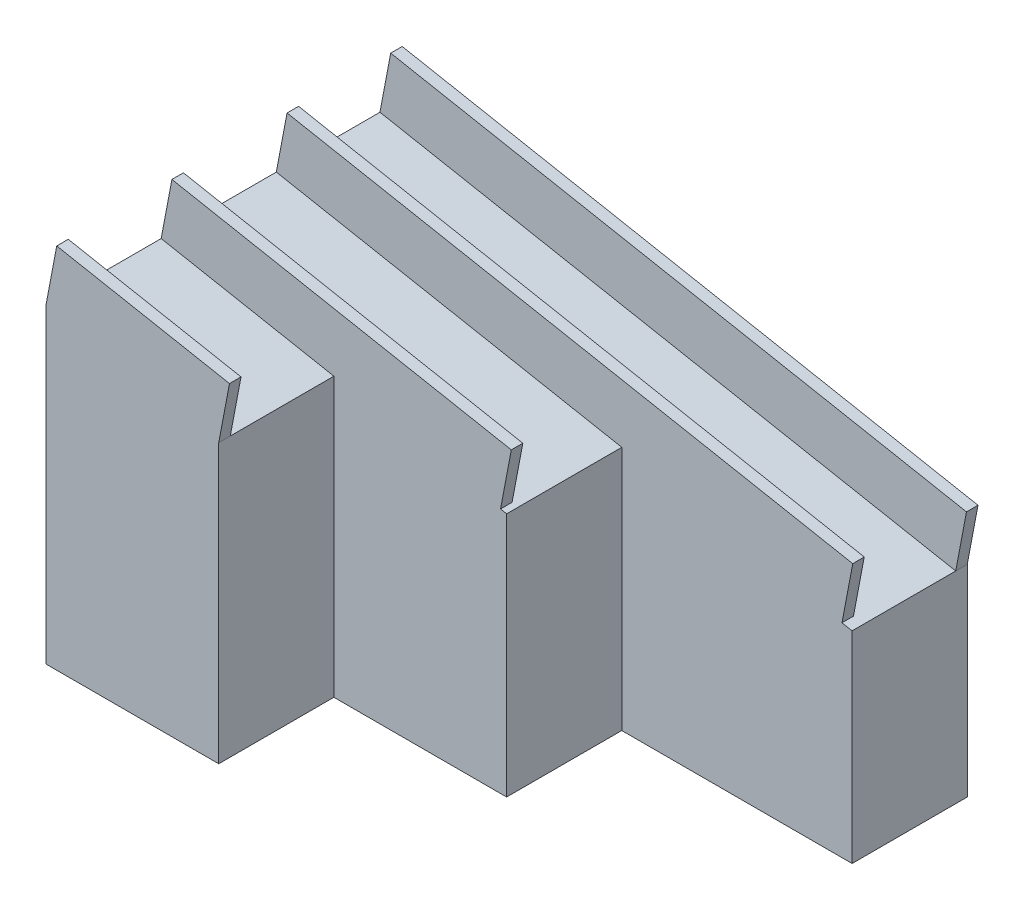
ISO-10303-21;
HEADER;
FILE_DESCRIPTION(('STEP AP214'),'2;1');
FILE_NAME('part.step','',(''),(''),'','','');
FILE_SCHEMA(('AUTOMOTIVE_DESIGN { 1 0 10303 214 1 1 1 1 }'));
ENDSEC;
DATA;
#1=APPLICATION_CONTEXT('core data for automotive mechanical design processes');
#2=APPLICATION_PROTOCOL_DEFINITION('international standard','automotive_design',2000,#1);
#3=PRODUCT_CONTEXT('',#1,'mechanical');
#4=PRODUCT('Part','Part','',(#3));
#5=PRODUCT_RELATED_PRODUCT_CATEGORY('part','',(#4));
#6=PRODUCT_DEFINITION_FORMATION('','',#4);
#7=PRODUCT_DEFINITION_CONTEXT('part definition',#1,'design');
#8=PRODUCT_DEFINITION('design','',#6,#7);
#9=PRODUCT_DEFINITION_SHAPE('','',#8);
#10=(LENGTH_UNIT() NAMED_UNIT(*) SI_UNIT(.MILLI.,.METRE.));
#11=(NAMED_UNIT(*) PLANE_ANGLE_UNIT() SI_UNIT($,.RADIAN.));
#12=(NAMED_UNIT(*) SI_UNIT($,.STERADIAN.) SOLID_ANGLE_UNIT());
#13=UNCERTAINTY_MEASURE_WITH_UNIT(LENGTH_MEASURE(1.E-05),#10,'distance_accuracy_value','');
#14=(GEOMETRIC_REPRESENTATION_CONTEXT(3) GLOBAL_UNCERTAINTY_ASSIGNED_CONTEXT((#13)) GLOBAL_UNIT_ASSIGNED_CONTEXT((#10,
#11,#12)) REPRESENTATION_CONTEXT('',''));
#15=CARTESIAN_POINT('',(0.,0.,0.));
#16=DIRECTION('',(0.,0.,1.));
#17=DIRECTION('',(1.,0.,0.));
#18=AXIS2_PLACEMENT_3D('',#15,#16,#17);
#19=CARTESIAN_POINT('',(0.,54.,20.));
#20=DIRECTION('',(-0.18666064582327,-0.982424451701422,0.));
#21=DIRECTION('',(0.982424451701422,-0.18666064582327,0.));
#22=AXIS2_PLACEMENT_3D('',#19,#20,#21);
#23=PLANE('',#22);
#24=DIRECTION('',(-0.982424451701422,0.18666064582327,0.));
#25=VECTOR('',#24,1.);
#26=CARTESIAN_POINT('',(30.,48.3,58.));
#27=LINE('',#26,#25);
#28=CARTESIAN_POINT('',(30.,48.3,58.));
#29=VERTEX_POINT('',#28);
#30=CARTESIAN_POINT('',(0.,54.,58.));
#31=VERTEX_POINT('',#30);
#32=EDGE_CURVE('E212',#29,#31,#27,.T.);
#33=ORIENTED_EDGE('',*,*,#32,.F.);
#34=DIRECTION('',(0.,0.,-1.));
#35=VECTOR('',#34,1.);
#36=CARTESIAN_POINT('',(30.,48.3,60.));
#37=LINE('',#36,#35);
#38=CARTESIAN_POINT('',(30.,48.3,40.));
#39=VERTEX_POINT('',#38);
#40=EDGE_CURVE('E356',#29,#39,#37,.T.);
#41=ORIENTED_EDGE('',*,*,#40,.T.);
#42=DIRECTION('',(0.982424451701422,-0.18666064582327,0.));
#43=VECTOR('',#42,1.);
#44=CARTESIAN_POINT('',(58.9454671020853,42.8003612506038,40.));
#45=LINE('',#44,#43);
#46=CARTESIAN_POINT('',(0.,54.,40.));
#47=VERTEX_POINT('',#46);
#48=EDGE_CURVE('E235',#47,#39,#45,.T.);
#49=ORIENTED_EDGE('',*,*,#48,.F.);
#50=DIRECTION('',(0.,0.,-1.));
#51=VECTOR('',#50,1.);
#52=CARTESIAN_POINT('',(0.,54.,20.));
#53=LINE('',#52,#51);
#54=EDGE_CURVE('E416',#31,#47,#53,.T.);
#55=ORIENTED_EDGE('',*,*,#54,.F.);
#56=EDGE_LOOP('',(#33,#41,#49,#55));
#57=FACE_BOUND('',#56,.T.);
#58=ADVANCED_FACE('F39',(#57),#23,.F.);
#59=DIRECTION('',(0.,0.,-1.));
#60=VECTOR('',#59,1.);
#61=CARTESIAN_POINT('',(58.9454671020853,42.8003612506038,38.));
#62=LINE('',#61,#60);
#63=CARTESIAN_POINT('',(58.9454671020853,42.8003612506038,40.));
#64=VERTEX_POINT('',#63);
#65=CARTESIAN_POINT('',(58.9454671020853,42.8003612506038,38.));
#66=VERTEX_POINT('',#65);
#67=EDGE_CURVE('E219',#64,#66,#62,.T.);
#68=ORIENTED_EDGE('',*,*,#67,.F.);
#69=DIRECTION('',(-0.982424451701422,0.18666064582327,0.));
#70=VECTOR('',#69,1.);
#71=CARTESIAN_POINT('',(60.,42.6,40.));
#72=LINE('',#71,#70);
#73=CARTESIAN_POINT('',(60.,42.6,40.));
#74=VERTEX_POINT('',#73);
#75=EDGE_CURVE('E367',#74,#64,#72,.T.);
#76=ORIENTED_EDGE('',*,*,#75,.F.);
#77=DIRECTION('',(0.,0.,-1.));
#78=VECTOR('',#77,1.);
#79=CARTESIAN_POINT('',(60.,42.6,40.));
#80=LINE('',#79,#78);
#81=CARTESIAN_POINT('',(60.,42.6,20.));
#82=VERTEX_POINT('',#81);
#83=EDGE_CURVE('E377',#74,#82,#80,.T.);
#84=ORIENTED_EDGE('',*,*,#83,.T.);
#85=DIRECTION('',(0.982424451701422,-0.18666064582327,0.));
#86=VECTOR('',#85,1.);
#87=CARTESIAN_POINT('',(98.2424451701422,35.333935417673,20.));
#88=LINE('',#87,#86);
#89=CARTESIAN_POINT('',(0.,54.,20.));
#90=VERTEX_POINT('',#89);
#91=EDGE_CURVE('E273',#90,#82,#88,.T.);
#92=ORIENTED_EDGE('',*,*,#91,.F.);
#93=CARTESIAN_POINT('',(0.,54.,38.));
#94=VERTEX_POINT('',#93);
#95=EDGE_CURVE('E446',#94,#90,#53,.T.);
#96=ORIENTED_EDGE('',*,*,#95,.F.);
#97=DIRECTION('',(-0.982424451701422,0.18666064582327,0.));
#98=VECTOR('',#97,1.);
#99=CARTESIAN_POINT('',(58.9454671020853,42.8003612506038,38.));
#100=LINE('',#99,#98);
#101=EDGE_CURVE('E224',#66,#94,#100,.T.);
#102=ORIENTED_EDGE('',*,*,#101,.F.);
#103=EDGE_LOOP('',(#68,#76,#84,#92,#96,#102));
#104=FACE_BOUND('',#103,.T.);
#105=ADVANCED_FACE('F485',(#104),#23,.F.);
#106=DIRECTION('',(0.,0.,-1.));
#107=VECTOR('',#106,1.);
#108=CARTESIAN_POINT('',(98.2424451701422,35.333935417673,18.));
#109=LINE('',#108,#107);
#110=CARTESIAN_POINT('',(98.2424451701422,35.333935417673,20.));
#111=VERTEX_POINT('',#110);
#112=CARTESIAN_POINT('',(98.2424451701422,35.333935417673,18.));
#113=VERTEX_POINT('',#112);
#114=EDGE_CURVE('E267',#111,#113,#109,.T.);
#115=ORIENTED_EDGE('',*,*,#114,.F.);
#116=DIRECTION('',(-0.982424451701422,0.18666064582327,0.));
#117=VECTOR('',#116,1.);
#118=CARTESIAN_POINT('',(0.,54.,20.));
#119=LINE('',#118,#117);
#120=CARTESIAN_POINT('',(100.,35.,20.));
#121=VERTEX_POINT('',#120);
#122=EDGE_CURVE('E396',#121,#111,#119,.T.);
#123=ORIENTED_EDGE('',*,*,#122,.F.);
#124=DIRECTION('',(0.,0.,-1.));
#125=VECTOR('',#124,1.);
#126=CARTESIAN_POINT('',(100.,35.,20.));
#127=LINE('',#126,#125);
#128=CARTESIAN_POINT('',(100.,35.,2.));
#129=VERTEX_POINT('',#128);
#130=EDGE_CURVE('E48',#121,#129,#127,.T.);
#131=ORIENTED_EDGE('',*,*,#130,.T.);
#132=DIRECTION('',(0.982424451701422,-0.18666064582327,0.));
#133=VECTOR('',#132,1.);
#134=CARTESIAN_POINT('',(0.,54.,2.));
#135=LINE('',#134,#133);
#136=CARTESIAN_POINT('',(0.,54.,2.));
#137=VERTEX_POINT('',#136);
#138=EDGE_CURVE('E323',#137,#129,#135,.T.);
#139=ORIENTED_EDGE('',*,*,#138,.F.);
#140=CARTESIAN_POINT('',(0.,54.,18.));
#141=VERTEX_POINT('',#140);
#142=EDGE_CURVE('E412',#141,#137,#53,.T.);
#143=ORIENTED_EDGE('',*,*,#142,.F.);
#144=DIRECTION('',(-0.982424451701422,0.18666064582327,0.));
#145=VECTOR('',#144,1.);
#146=CARTESIAN_POINT('',(98.2424451701422,35.333935417673,18.));
#147=LINE('',#146,#145);
#148=EDGE_CURVE('E286',#113,#141,#147,.T.);
#149=ORIENTED_EDGE('',*,*,#148,.F.);
#150=EDGE_LOOP('',(#115,#123,#131,#139,#143,#149));
#151=FACE_BOUND('',#150,.T.);
#152=ADVANCED_FACE('F422',(#151),#23,.F.);
#153=CARTESIAN_POINT('',(0.,0.,20.));
#154=DIRECTION('',(0.,0.,-1.));
#155=DIRECTION('',(-1.,0.,0.));
#156=AXIS2_PLACEMENT_3D('',#153,#154,#155);
#157=PLANE('',#156);
#158=DIRECTION('',(0.,1.,0.));
#159=VECTOR('',#158,1.);
#160=CARTESIAN_POINT('',(60.,0.,20.));
#161=LINE('',#160,#159);
#162=CARTESIAN_POINT('',(60.,0.,20.));
#163=VERTEX_POINT('',#162);
#164=EDGE_CURVE('E366',#163,#82,#161,.T.);
#165=ORIENTED_EDGE('',*,*,#164,.F.);
#166=DIRECTION('',(1.,0.,0.));
#167=VECTOR('',#166,1.);
#168=CARTESIAN_POINT('',(100.,0.,20.));
#169=LINE('',#168,#167);
#170=CARTESIAN_POINT('',(100.,0.,20.));
#171=VERTEX_POINT('',#170);
#172=EDGE_CURVE('E389',#163,#171,#169,.T.);
#173=ORIENTED_EDGE('',*,*,#172,.T.);
#174=DIRECTION('',(0.,1.,0.));
#175=VECTOR('',#174,1.);
#176=CARTESIAN_POINT('',(100.,35.,20.));
#177=LINE('',#176,#175);
#178=EDGE_CURVE('E392',#171,#121,#177,.T.);
#179=ORIENTED_EDGE('',*,*,#178,.T.);
#180=ORIENTED_EDGE('',*,*,#122,.T.);
#181=DIRECTION('',(-0.18666064582327,-0.982424451701422,0.));
#182=VECTOR('',#181,1.);
#183=CARTESIAN_POINT('',(100.109051628375,45.1581799346872,20.));
#184=LINE('',#183,#182);
#185=CARTESIAN_POINT('',(100.109051628375,45.1581799346872,20.));
#186=VERTEX_POINT('',#185);
#187=EDGE_CURVE('E282',#186,#111,#184,.T.);
#188=ORIENTED_EDGE('',*,*,#187,.F.);
#189=DIRECTION('',(0.982424451701422,-0.18666064582327,0.));
#190=VECTOR('',#189,1.);
#191=CARTESIAN_POINT('',(100.109051628375,45.1581799346872,20.));
#192=LINE('',#191,#190);
#193=CARTESIAN_POINT('',(1.8666064582327,63.8242445170142,20.));
#194=VERTEX_POINT('',#193);
#195=EDGE_CURVE('E279',#194,#186,#192,.T.);
#196=ORIENTED_EDGE('',*,*,#195,.F.);
#197=DIRECTION('',(-0.18666064582327,-0.982424451701422,0.));
#198=VECTOR('',#197,1.);
#199=CARTESIAN_POINT('',(1.8666064582327,63.8242445170142,20.));
#200=LINE('',#199,#198);
#201=EDGE_CURVE('E296',#194,#90,#200,.T.);
#202=ORIENTED_EDGE('',*,*,#201,.T.);
#203=ORIENTED_EDGE('',*,*,#91,.T.);
#204=EDGE_LOOP('',(#165,#173,#179,#180,#188,#196,#202,#203));
#205=FACE_BOUND('',#204,.T.);
#206=ADVANCED_FACE('F511',(#205),#157,.F.);
#207=CARTESIAN_POINT('',(100.,0.,20.));
#208=DIRECTION('',(0.,1.,0.));
#209=DIRECTION('',(-1.,0.,0.));
#210=AXIS2_PLACEMENT_3D('',#207,#208,#209);
#211=PLANE('',#210);
#212=DIRECTION('',(1.,0.,0.));
#213=VECTOR('',#212,1.);
#214=CARTESIAN_POINT('',(100.,0.,0.));
#215=LINE('',#214,#213);
#216=CARTESIAN_POINT('',(0.,0.,0.));
#217=VERTEX_POINT('',#216);
#218=CARTESIAN_POINT('',(100.,0.,0.));
#219=VERTEX_POINT('',#218);
#220=EDGE_CURVE('E388',#217,#219,#215,.T.);
#221=ORIENTED_EDGE('',*,*,#220,.T.);
#222=DIRECTION('',(0.,0.,-1.));
#223=VECTOR('',#222,1.);
#224=CARTESIAN_POINT('',(100.,0.,20.));
#225=LINE('',#224,#223);
#226=EDGE_CURVE('E11',#171,#219,#225,.T.);
#227=ORIENTED_EDGE('',*,*,#226,.F.);
#228=ORIENTED_EDGE('',*,*,#172,.F.);
#229=DIRECTION('',(0.,0.,-1.));
#230=VECTOR('',#229,1.);
#231=CARTESIAN_POINT('',(60.,0.,40.));
#232=LINE('',#231,#230);
#233=CARTESIAN_POINT('',(60.,0.,40.));
#234=VERTEX_POINT('',#233);
#235=EDGE_CURVE('E384',#234,#163,#232,.T.);
#236=ORIENTED_EDGE('',*,*,#235,.F.);
#237=DIRECTION('',(1.,0.,0.));
#238=VECTOR('',#237,1.);
#239=CARTESIAN_POINT('',(0.,0.,40.));
#240=LINE('',#239,#238);
#241=CARTESIAN_POINT('',(30.,0.,40.));
#242=VERTEX_POINT('',#241);
#243=EDGE_CURVE('E371',#242,#234,#240,.T.);
#244=ORIENTED_EDGE('',*,*,#243,.F.);
#245=DIRECTION('',(0.,0.,-1.));
#246=VECTOR('',#245,1.);
#247=CARTESIAN_POINT('',(30.,0.,60.));
#248=LINE('',#247,#246);
#249=CARTESIAN_POINT('',(30.,0.,60.));
#250=VERTEX_POINT('',#249);
#251=EDGE_CURVE('E362',#250,#242,#248,.T.);
#252=ORIENTED_EDGE('',*,*,#251,.F.);
#253=DIRECTION('',(1.,0.,0.));
#254=VECTOR('',#253,1.);
#255=CARTESIAN_POINT('',(30.,0.,60.));
#256=LINE('',#255,#254);
#257=CARTESIAN_POINT('',(0.,0.,60.));
#258=VERTEX_POINT('',#257);
#259=EDGE_CURVE('E349',#258,#250,#256,.T.);
#260=ORIENTED_EDGE('',*,*,#259,.F.);
#261=DIRECTION('',(0.,0.,-1.));
#262=VECTOR('',#261,1.);
#263=CARTESIAN_POINT('',(0.,0.,20.));
#264=LINE('',#263,#262);
#265=EDGE_CURVE('E400',#258,#217,#264,.T.);
#266=ORIENTED_EDGE('',*,*,#265,.T.);
#267=EDGE_LOOP('',(#221,#227,#228,#236,#244,#252,#260,#266));
#268=FACE_BOUND('',#267,.T.);
#269=ADVANCED_FACE('F41',(#268),#211,.F.);
#270=CARTESIAN_POINT('',(100.,35.,20.));
#271=DIRECTION('',(-1.,0.,0.));
#272=DIRECTION('',(0.,-1.,0.));
#273=AXIS2_PLACEMENT_3D('',#270,#271,#272);
#274=PLANE('',#273);
#275=DIRECTION('',(0.,1.,0.));
#276=VECTOR('',#275,1.);
#277=CARTESIAN_POINT('',(100.,35.,0.));
#278=LINE('',#277,#276);
#279=CARTESIAN_POINT('',(100.,35.,0.));
#280=VERTEX_POINT('',#279);
#281=EDGE_CURVE('E404',#219,#280,#278,.T.);
#282=ORIENTED_EDGE('',*,*,#281,.T.);
#283=DIRECTION('',(0.,0.,-1.));
#284=VECTOR('',#283,1.);
#285=CARTESIAN_POINT('',(100.,35.,0.));
#286=LINE('',#285,#284);
#287=EDGE_CURVE('E63',#129,#280,#286,.T.);
#288=ORIENTED_EDGE('',*,*,#287,.F.);
#289=ORIENTED_EDGE('',*,*,#130,.F.);
#290=ORIENTED_EDGE('',*,*,#178,.F.);
#291=ORIENTED_EDGE('',*,*,#226,.T.);
#292=EDGE_LOOP('',(#282,#288,#289,#290,#291));
#293=FACE_BOUND('',#292,.T.);
#294=ADVANCED_FACE('F520',(#293),#274,.F.);
#295=CARTESIAN_POINT('',(0.,0.,20.));
#296=DIRECTION('',(1.,0.,0.));
#297=DIRECTION('',(0.,0.,-1.));
#298=AXIS2_PLACEMENT_3D('',#295,#296,#297);
#299=PLANE('',#298);
#300=DIRECTION('',(0.,-1.,0.));
#301=VECTOR('',#300,1.);
#302=CARTESIAN_POINT('',(0.,0.,0.));
#303=LINE('',#302,#301);
#304=CARTESIAN_POINT('',(0.,54.,0.));
#305=VERTEX_POINT('',#304);
#306=EDGE_CURVE('E393',#305,#217,#303,.T.);
#307=ORIENTED_EDGE('',*,*,#306,.T.);
#308=ORIENTED_EDGE('',*,*,#265,.F.);
#309=DIRECTION('',(0.,-1.,0.));
#310=VECTOR('',#309,1.);
#311=CARTESIAN_POINT('',(0.,54.,60.));
#312=LINE('',#311,#310);
#313=CARTESIAN_POINT('',(0.,54.,60.));
#314=VERTEX_POINT('',#313);
#315=EDGE_CURVE('E345',#314,#258,#312,.T.);
#316=ORIENTED_EDGE('',*,*,#315,.F.);
#317=EDGE_CURVE('E413',#314,#31,#53,.T.);
#318=ORIENTED_EDGE('',*,*,#317,.T.);
#319=ORIENTED_EDGE('',*,*,#54,.T.);
#320=DIRECTION('',(0.,0.,1.));
#321=VECTOR('',#320,1.);
#322=CARTESIAN_POINT('',(0.,54.,38.));
#323=LINE('',#322,#321);
#324=EDGE_CURVE('E247',#94,#47,#323,.T.);
#325=ORIENTED_EDGE('',*,*,#324,.F.);
#326=ORIENTED_EDGE('',*,*,#95,.T.);
#327=DIRECTION('',(0.,0.,1.));
#328=VECTOR('',#327,1.);
#329=CARTESIAN_POINT('',(0.,54.,18.));
#330=LINE('',#329,#328);
#331=EDGE_CURVE('E289',#141,#90,#330,.T.);
#332=ORIENTED_EDGE('',*,*,#331,.F.);
#333=ORIENTED_EDGE('',*,*,#142,.T.);
#334=DIRECTION('',(0.,0.,1.));
#335=VECTOR('',#334,1.);
#336=CARTESIAN_POINT('',(0.,54.,0.));
#337=LINE('',#336,#335);
#338=EDGE_CURVE('E305',#305,#137,#337,.T.);
#339=ORIENTED_EDGE('',*,*,#338,.F.);
#340=EDGE_LOOP('',(#307,#308,#316,#318,#319,#325,#326,#332,#333,#339));
#341=FACE_BOUND('',#340,.T.);
#342=ADVANCED_FACE('F442',(#341),#299,.F.);
#343=CARTESIAN_POINT('',(0.,0.,0.));
#344=DIRECTION('',(0.,0.,-1.));
#345=DIRECTION('',(-1.,0.,0.));
#346=AXIS2_PLACEMENT_3D('',#343,#344,#345);
#347=PLANE('',#346);
#348=ORIENTED_EDGE('',*,*,#220,.F.);
#349=ORIENTED_EDGE('',*,*,#306,.F.);
#350=DIRECTION('',(-0.18666064582327,-0.982424451701422,0.));
#351=VECTOR('',#350,1.);
#352=CARTESIAN_POINT('',(1.8666064582327,63.8242445170142,0.));
#353=LINE('',#352,#351);
#354=CARTESIAN_POINT('',(1.8666064582327,63.8242445170142,0.));
#355=VERTEX_POINT('',#354);
#356=EDGE_CURVE('E319',#355,#305,#353,.T.);
#357=ORIENTED_EDGE('',*,*,#356,.F.);
#358=DIRECTION('',(-0.982424451701422,0.18666064582327,0.));
#359=VECTOR('',#358,1.);
#360=CARTESIAN_POINT('',(1.8666064582327,63.8242445170142,0.));
#361=LINE('',#360,#359);
#362=CARTESIAN_POINT('',(101.866606458233,44.8242445170142,0.));
#363=VERTEX_POINT('',#362);
#364=EDGE_CURVE('E316',#363,#355,#361,.T.);
#365=ORIENTED_EDGE('',*,*,#364,.F.);
#366=DIRECTION('',(-0.18666064582327,-0.982424451701422,0.));
#367=VECTOR('',#366,1.);
#368=CARTESIAN_POINT('',(101.866606458233,44.8242445170142,0.));
#369=LINE('',#368,#367);
#370=EDGE_CURVE('E332',#363,#280,#369,.T.);
#371=ORIENTED_EDGE('',*,*,#370,.T.);
#372=ORIENTED_EDGE('',*,*,#281,.F.);
#373=EDGE_LOOP('',(#348,#349,#357,#365,#371,#372));
#374=FACE_BOUND('',#373,.T.);
#375=ADVANCED_FACE('F524',(#374),#347,.T.);
#376=CARTESIAN_POINT('',(60.,0.,40.));
#377=DIRECTION('',(-1.,0.,0.));
#378=DIRECTION('',(0.,0.,1.));
#379=AXIS2_PLACEMENT_3D('',#376,#377,#378);
#380=PLANE('',#379);
#381=ORIENTED_EDGE('',*,*,#164,.T.);
#382=ORIENTED_EDGE('',*,*,#83,.F.);
#383=DIRECTION('',(0.,1.,0.));
#384=VECTOR('',#383,1.);
#385=CARTESIAN_POINT('',(60.,0.,40.));
#386=LINE('',#385,#384);
#387=EDGE_CURVE('E374',#234,#74,#386,.T.);
#388=ORIENTED_EDGE('',*,*,#387,.F.);
#389=ORIENTED_EDGE('',*,*,#235,.T.);
#390=EDGE_LOOP('',(#381,#382,#388,#389));
#391=FACE_BOUND('',#390,.T.);
#392=ADVANCED_FACE('F480',(#391),#380,.F.);
#393=CARTESIAN_POINT('',(0.,0.,40.));
#394=DIRECTION('',(0.,0.,1.));
#395=DIRECTION('',(1.,0.,0.));
#396=AXIS2_PLACEMENT_3D('',#393,#394,#395);
#397=PLANE('',#396);
#398=DIRECTION('',(0.,1.,0.));
#399=VECTOR('',#398,1.);
#400=CARTESIAN_POINT('',(30.,48.3,40.));
#401=LINE('',#400,#399);
#402=EDGE_CURVE('E344',#242,#39,#401,.T.);
#403=ORIENTED_EDGE('',*,*,#402,.F.);
#404=ORIENTED_EDGE('',*,*,#243,.T.);
#405=ORIENTED_EDGE('',*,*,#387,.T.);
#406=ORIENTED_EDGE('',*,*,#75,.T.);
#407=DIRECTION('',(-0.18666064582327,-0.982424451701422,0.));
#408=VECTOR('',#407,1.);
#409=CARTESIAN_POINT('',(60.812073560318,52.624605767618,40.));
#410=LINE('',#409,#408);
#411=CARTESIAN_POINT('',(60.812073560318,52.624605767618,40.));
#412=VERTEX_POINT('',#411);
#413=EDGE_CURVE('E243',#412,#64,#410,.T.);
#414=ORIENTED_EDGE('',*,*,#413,.F.);
#415=DIRECTION('',(0.982424451701422,-0.18666064582327,0.));
#416=VECTOR('',#415,1.);
#417=CARTESIAN_POINT('',(60.812073560318,52.624605767618,40.));
#418=LINE('',#417,#416);
#419=CARTESIAN_POINT('',(1.8666064582327,63.8242445170142,40.));
#420=VERTEX_POINT('',#419);
#421=EDGE_CURVE('E241',#420,#412,#418,.T.);
#422=ORIENTED_EDGE('',*,*,#421,.F.);
#423=DIRECTION('',(-0.18666064582327,-0.982424451701422,0.));
#424=VECTOR('',#423,1.);
#425=CARTESIAN_POINT('',(1.8666064582327,63.8242445170142,40.));
#426=LINE('',#425,#424);
#427=EDGE_CURVE('E256',#420,#47,#426,.T.);
#428=ORIENTED_EDGE('',*,*,#427,.T.);
#429=ORIENTED_EDGE('',*,*,#48,.T.);
#430=EDGE_LOOP('',(#403,#404,#405,#406,#414,#422,#428,#429));
#431=FACE_BOUND('',#430,.T.);
#432=ADVANCED_FACE('F463',(#431),#397,.T.);
#433=CARTESIAN_POINT('',(30.,48.3,60.));
#434=DIRECTION('',(-1.,0.,0.));
#435=DIRECTION('',(0.,-1.,0.));
#436=AXIS2_PLACEMENT_3D('',#433,#434,#435);
#437=PLANE('',#436);
#438=ORIENTED_EDGE('',*,*,#402,.T.);
#439=ORIENTED_EDGE('',*,*,#40,.F.);
#440=CARTESIAN_POINT('',(30.,48.3,60.));
#441=VERTEX_POINT('',#440);
#442=EDGE_CURVE('E216',#441,#29,#37,.T.);
#443=ORIENTED_EDGE('',*,*,#442,.F.);
#444=DIRECTION('',(0.,1.,0.));
#445=VECTOR('',#444,1.);
#446=CARTESIAN_POINT('',(30.,48.3,60.));
#447=LINE('',#446,#445);
#448=EDGE_CURVE('E352',#250,#441,#447,.T.);
#449=ORIENTED_EDGE('',*,*,#448,.F.);
#450=ORIENTED_EDGE('',*,*,#251,.T.);
#451=EDGE_LOOP('',(#438,#439,#443,#449,#450));
#452=FACE_BOUND('',#451,.T.);
#453=ADVANCED_FACE('F468',(#452),#437,.F.);
#454=CARTESIAN_POINT('',(0.,0.,60.));
#455=DIRECTION('',(0.,0.,-1.));
#456=DIRECTION('',(-1.,0.,0.));
#457=AXIS2_PLACEMENT_3D('',#454,#455,#456);
#458=PLANE('',#457);
#459=ORIENTED_EDGE('',*,*,#448,.T.);
#460=DIRECTION('',(-0.18666064582327,-0.982424451701422,0.));
#461=VECTOR('',#460,1.);
#462=CARTESIAN_POINT('',(31.8666064582327,58.1242445170142,60.));
#463=LINE('',#462,#461);
#464=CARTESIAN_POINT('',(31.8666064582327,58.1242445170142,60.));
#465=VERTEX_POINT('',#464);
#466=EDGE_CURVE('E539',#465,#441,#463,.T.);
#467=ORIENTED_EDGE('',*,*,#466,.F.);
#468=DIRECTION('',(0.982424451701422,-0.18666064582327,0.));
#469=VECTOR('',#468,1.);
#470=CARTESIAN_POINT('',(31.8666064582327,58.1242445170142,60.));
#471=LINE('',#470,#469);
#472=CARTESIAN_POINT('',(1.8666064582327,63.8242445170142,60.));
#473=VERTEX_POINT('',#472);
#474=EDGE_CURVE('E208',#473,#465,#471,.T.);
#475=ORIENTED_EDGE('',*,*,#474,.F.);
#476=DIRECTION('',(-0.18666064582327,-0.982424451701422,0.));
#477=VECTOR('',#476,1.);
#478=CARTESIAN_POINT('',(1.8666064582327,63.8242445170142,60.));
#479=LINE('',#478,#477);
#480=EDGE_CURVE('E226',#473,#314,#479,.T.);
#481=ORIENTED_EDGE('',*,*,#480,.T.);
#482=ORIENTED_EDGE('',*,*,#315,.T.);
#483=ORIENTED_EDGE('',*,*,#259,.T.);
#484=EDGE_LOOP('',(#459,#467,#475,#481,#482,#483));
#485=FACE_BOUND('',#484,.T.);
#486=ADVANCED_FACE('F535',(#485),#458,.F.);
#487=CARTESIAN_POINT('',(1.8666064582327,63.8242445170142,0.));
#488=DIRECTION('',(0.982424451701422,-0.18666064582327,0.));
#489=DIRECTION('',(0.18666064582327,0.982424451701422,0.));
#490=AXIS2_PLACEMENT_3D('',#487,#488,#489);
#491=PLANE('',#490);
#492=ORIENTED_EDGE('',*,*,#338,.T.);
#493=DIRECTION('',(-0.18666064582327,-0.982424451701422,0.));
#494=VECTOR('',#493,1.);
#495=CARTESIAN_POINT('',(1.8666064582327,63.8242445170142,2.));
#496=LINE('',#495,#494);
#497=CARTESIAN_POINT('',(1.8666064582327,63.8242445170142,2.));
#498=VERTEX_POINT('',#497);
#499=EDGE_CURVE('E340',#498,#137,#496,.T.);
#500=ORIENTED_EDGE('',*,*,#499,.F.);
#501=DIRECTION('',(0.,0.,1.));
#502=VECTOR('',#501,1.);
#503=CARTESIAN_POINT('',(1.8666064582327,63.8242445170142,0.));
#504=LINE('',#503,#502);
#505=EDGE_CURVE('E306',#355,#498,#504,.T.);
#506=ORIENTED_EDGE('',*,*,#505,.F.);
#507=ORIENTED_EDGE('',*,*,#356,.T.);
#508=EDGE_LOOP('',(#492,#500,#506,#507));
#509=FACE_BOUND('',#508,.T.);
#510=ADVANCED_FACE('F439',(#509),#491,.F.);
#511=CARTESIAN_POINT('',(1.8666064582327,63.8242445170142,2.));
#512=DIRECTION('',(0.,0.,-1.));
#513=DIRECTION('',(-1.,0.,0.));
#514=AXIS2_PLACEMENT_3D('',#511,#512,#513);
#515=PLANE('',#514);
#516=ORIENTED_EDGE('',*,*,#138,.T.);
#517=DIRECTION('',(-0.18666064582327,-0.982424451701422,0.));
#518=VECTOR('',#517,1.);
#519=CARTESIAN_POINT('',(101.866606458233,44.8242445170142,2.));
#520=LINE('',#519,#518);
#521=CARTESIAN_POINT('',(101.866606458233,44.8242445170142,2.));
#522=VERTEX_POINT('',#521);
#523=EDGE_CURVE('E336',#522,#129,#520,.T.);
#524=ORIENTED_EDGE('',*,*,#523,.F.);
#525=DIRECTION('',(0.982424451701422,-0.18666064582327,0.));
#526=VECTOR('',#525,1.);
#527=CARTESIAN_POINT('',(1.8666064582327,63.8242445170142,2.));
#528=LINE('',#527,#526);
#529=EDGE_CURVE('E310',#498,#522,#528,.T.);
#530=ORIENTED_EDGE('',*,*,#529,.F.);
#531=ORIENTED_EDGE('',*,*,#499,.T.);
#532=EDGE_LOOP('',(#516,#524,#530,#531));
#533=FACE_BOUND('',#532,.T.);
#534=ADVANCED_FACE('F427',(#533),#515,.F.);
#535=CARTESIAN_POINT('',(101.866606458233,44.8242445170142,0.));
#536=DIRECTION('',(-0.982424451701422,0.18666064582327,0.));
#537=DIRECTION('',(-0.18666064582327,-0.982424451701422,0.));
#538=AXIS2_PLACEMENT_3D('',#535,#536,#537);
#539=PLANE('',#538);
#540=ORIENTED_EDGE('',*,*,#287,.T.);
#541=ORIENTED_EDGE('',*,*,#370,.F.);
#542=DIRECTION('',(0.,0.,-1.));
#543=VECTOR('',#542,1.);
#544=CARTESIAN_POINT('',(101.866606458233,44.8242445170142,0.));
#545=LINE('',#544,#543);
#546=EDGE_CURVE('E313',#522,#363,#545,.T.);
#547=ORIENTED_EDGE('',*,*,#546,.F.);
#548=ORIENTED_EDGE('',*,*,#523,.T.);
#549=EDGE_LOOP('',(#540,#541,#547,#548));
#550=FACE_BOUND('',#549,.T.);
#551=ADVANCED_FACE('F431',(#550),#539,.F.);
#552=CARTESIAN_POINT('',(11.7691255200993,61.9427658952596,0.));
#553=DIRECTION('',(0.18666064582327,0.982424451701422,0.));
#554=DIRECTION('',(-0.982424451701422,0.18666064582327,0.));
#555=AXIS2_PLACEMENT_3D('',#552,#553,#554);
#556=PLANE('',#555);
#557=ORIENTED_EDGE('',*,*,#505,.T.);
#558=ORIENTED_EDGE('',*,*,#529,.T.);
#559=ORIENTED_EDGE('',*,*,#546,.T.);
#560=ORIENTED_EDGE('',*,*,#364,.T.);
#561=EDGE_LOOP('',(#557,#558,#559,#560));
#562=FACE_BOUND('',#561,.T.);
#563=ADVANCED_FACE('F435',(#562),#556,.T.);
#564=CARTESIAN_POINT('',(100.109051628375,45.1581799346872,18.));
#565=DIRECTION('',(-0.982424451701422,0.18666064582327,0.));
#566=DIRECTION('',(-0.18666064582327,-0.982424451701422,0.));
#567=AXIS2_PLACEMENT_3D('',#564,#565,#566);
#568=PLANE('',#567);
#569=ORIENTED_EDGE('',*,*,#114,.T.);
#570=DIRECTION('',(-0.18666064582327,-0.982424451701422,0.));
#571=VECTOR('',#570,1.);
#572=CARTESIAN_POINT('',(100.109051628375,45.1581799346872,18.));
#573=LINE('',#572,#571);
#574=CARTESIAN_POINT('',(100.109051628375,45.1581799346872,18.));
#575=VERTEX_POINT('',#574);
#576=EDGE_CURVE('E302',#575,#113,#573,.T.);
#577=ORIENTED_EDGE('',*,*,#576,.F.);
#578=DIRECTION('',(0.,0.,-1.));
#579=VECTOR('',#578,1.);
#580=CARTESIAN_POINT('',(100.109051628375,45.1581799346872,18.));
#581=LINE('',#580,#579);
#582=EDGE_CURVE('E268',#186,#575,#581,.T.);
#583=ORIENTED_EDGE('',*,*,#582,.F.);
#584=ORIENTED_EDGE('',*,*,#187,.T.);
#585=EDGE_LOOP('',(#569,#577,#583,#584));
#586=FACE_BOUND('',#585,.T.);
#587=ADVANCED_FACE('F627',(#586),#568,.F.);
#588=CARTESIAN_POINT('',(100.109051628375,45.1581799346872,18.));
#589=DIRECTION('',(0.,0.,1.));
#590=DIRECTION('',(1.,0.,0.));
#591=AXIS2_PLACEMENT_3D('',#588,#589,#590);
#592=PLANE('',#591);
#593=ORIENTED_EDGE('',*,*,#148,.T.);
#594=DIRECTION('',(-0.18666064582327,-0.982424451701422,0.));
#595=VECTOR('',#594,1.);
#596=CARTESIAN_POINT('',(1.8666064582327,63.8242445170142,18.));
#597=LINE('',#596,#595);
#598=CARTESIAN_POINT('',(1.8666064582327,63.8242445170142,18.));
#599=VERTEX_POINT('',#598);
#600=EDGE_CURVE('E55',#599,#141,#597,.T.);
#601=ORIENTED_EDGE('',*,*,#600,.F.);
#602=DIRECTION('',(-0.982424451701422,0.18666064582327,0.));
#603=VECTOR('',#602,1.);
#604=CARTESIAN_POINT('',(100.109051628375,45.1581799346872,18.));
#605=LINE('',#604,#603);
#606=EDGE_CURVE('E272',#575,#599,#605,.T.);
#607=ORIENTED_EDGE('',*,*,#606,.F.);
#608=ORIENTED_EDGE('',*,*,#576,.T.);
#609=EDGE_LOOP('',(#593,#601,#607,#608));
#610=FACE_BOUND('',#609,.T.);
#611=ADVANCED_FACE('F619',(#610),#592,.F.);
#612=CARTESIAN_POINT('',(1.8666064582327,63.8242445170142,18.));
#613=DIRECTION('',(0.982424451701422,-0.18666064582327,0.));
#614=DIRECTION('',(0.18666064582327,0.982424451701422,0.));
#615=AXIS2_PLACEMENT_3D('',#612,#613,#614);
#616=PLANE('',#615);
#617=ORIENTED_EDGE('',*,*,#331,.T.);
#618=ORIENTED_EDGE('',*,*,#201,.F.);
#619=DIRECTION('',(0.,0.,1.));
#620=VECTOR('',#619,1.);
#621=CARTESIAN_POINT('',(1.8666064582327,63.8242445170142,18.));
#622=LINE('',#621,#620);
#623=EDGE_CURVE('E276',#599,#194,#622,.T.);
#624=ORIENTED_EDGE('',*,*,#623,.F.);
#625=ORIENTED_EDGE('',*,*,#600,.T.);
#626=EDGE_LOOP('',(#617,#618,#624,#625));
#627=FACE_BOUND('',#626,.T.);
#628=ADVANCED_FACE('F610',(#627),#616,.F.);
#629=CARTESIAN_POINT('',(11.7691255200993,61.9427658952596,0.));
#630=DIRECTION('',(-0.18666064582327,-0.982424451701422,0.));
#631=DIRECTION('',(0.982424451701422,-0.18666064582327,0.));
#632=AXIS2_PLACEMENT_3D('',#629,#630,#631);
#633=PLANE('',#632);
#634=ORIENTED_EDGE('',*,*,#582,.T.);
#635=ORIENTED_EDGE('',*,*,#606,.T.);
#636=ORIENTED_EDGE('',*,*,#623,.T.);
#637=ORIENTED_EDGE('',*,*,#195,.T.);
#638=EDGE_LOOP('',(#634,#635,#636,#637));
#639=FACE_BOUND('',#638,.T.);
#640=ADVANCED_FACE('F502',(#639),#633,.F.);
#641=CARTESIAN_POINT('',(60.812073560318,52.624605767618,38.));
#642=DIRECTION('',(-0.982424451701422,0.18666064582327,0.));
#643=DIRECTION('',(-0.18666064582327,-0.982424451701422,0.));
#644=AXIS2_PLACEMENT_3D('',#641,#642,#643);
#645=PLANE('',#644);
#646=ORIENTED_EDGE('',*,*,#67,.T.);
#647=DIRECTION('',(-0.18666064582327,-0.982424451701422,0.));
#648=VECTOR('',#647,1.);
#649=CARTESIAN_POINT('',(60.812073560318,52.624605767618,38.));
#650=LINE('',#649,#648);
#651=CARTESIAN_POINT('',(60.812073560318,52.624605767618,38.));
#652=VERTEX_POINT('',#651);
#653=EDGE_CURVE('E264',#652,#66,#650,.T.);
#654=ORIENTED_EDGE('',*,*,#653,.F.);
#655=DIRECTION('',(0.,0.,-1.));
#656=VECTOR('',#655,1.);
#657=CARTESIAN_POINT('',(60.812073560318,52.624605767618,38.));
#658=LINE('',#657,#656);
#659=EDGE_CURVE('E230',#412,#652,#658,.T.);
#660=ORIENTED_EDGE('',*,*,#659,.F.);
#661=ORIENTED_EDGE('',*,*,#413,.T.);
#662=EDGE_LOOP('',(#646,#654,#660,#661));
#663=FACE_BOUND('',#662,.T.);
#664=ADVANCED_FACE('F490',(#663),#645,.F.);
#665=CARTESIAN_POINT('',(60.812073560318,52.624605767618,38.));
#666=DIRECTION('',(0.,0.,1.));
#667=DIRECTION('',(1.,0.,0.));
#668=AXIS2_PLACEMENT_3D('',#665,#666,#667);
#669=PLANE('',#668);
#670=ORIENTED_EDGE('',*,*,#101,.T.);
#671=DIRECTION('',(-0.18666064582327,-0.982424451701422,0.));
#672=VECTOR('',#671,1.);
#673=CARTESIAN_POINT('',(1.8666064582327,63.8242445170142,38.));
#674=LINE('',#673,#672);
#675=CARTESIAN_POINT('',(1.8666064582327,63.8242445170142,38.));
#676=VERTEX_POINT('',#675);
#677=EDGE_CURVE('E260',#676,#94,#674,.T.);
#678=ORIENTED_EDGE('',*,*,#677,.F.);
#679=DIRECTION('',(-0.982424451701422,0.18666064582327,0.));
#680=VECTOR('',#679,1.);
#681=CARTESIAN_POINT('',(60.812073560318,52.624605767618,38.));
#682=LINE('',#681,#680);
#683=EDGE_CURVE('E234',#652,#676,#682,.T.);
#684=ORIENTED_EDGE('',*,*,#683,.F.);
#685=ORIENTED_EDGE('',*,*,#653,.T.);
#686=EDGE_LOOP('',(#670,#678,#684,#685));
#687=FACE_BOUND('',#686,.T.);
#688=ADVANCED_FACE('F494',(#687),#669,.F.);
#689=CARTESIAN_POINT('',(1.8666064582327,63.8242445170142,38.));
#690=DIRECTION('',(0.982424451701422,-0.18666064582327,0.));
#691=DIRECTION('',(0.18666064582327,0.982424451701422,0.));
#692=AXIS2_PLACEMENT_3D('',#689,#690,#691);
#693=PLANE('',#692);
#694=ORIENTED_EDGE('',*,*,#324,.T.);
#695=ORIENTED_EDGE('',*,*,#427,.F.);
#696=DIRECTION('',(0.,0.,1.));
#697=VECTOR('',#696,1.);
#698=CARTESIAN_POINT('',(1.8666064582327,63.8242445170142,38.));
#699=LINE('',#698,#697);
#700=EDGE_CURVE('E238',#676,#420,#699,.T.);
#701=ORIENTED_EDGE('',*,*,#700,.F.);
#702=ORIENTED_EDGE('',*,*,#677,.T.);
#703=EDGE_LOOP('',(#694,#695,#701,#702));
#704=FACE_BOUND('',#703,.T.);
#705=ADVANCED_FACE('F458',(#704),#693,.F.);
#706=CARTESIAN_POINT('',(11.7691255200993,61.9427658952596,0.));
#707=DIRECTION('',(-0.18666064582327,-0.982424451701422,0.));
#708=DIRECTION('',(0.982424451701422,-0.18666064582327,0.));
#709=AXIS2_PLACEMENT_3D('',#706,#707,#708);
#710=PLANE('',#709);
#711=ORIENTED_EDGE('',*,*,#659,.T.);
#712=ORIENTED_EDGE('',*,*,#683,.T.);
#713=ORIENTED_EDGE('',*,*,#700,.T.);
#714=ORIENTED_EDGE('',*,*,#421,.T.);
#715=EDGE_LOOP('',(#711,#712,#713,#714));
#716=FACE_BOUND('',#715,.T.);
#717=ADVANCED_FACE('F492',(#716),#710,.F.);
#718=CARTESIAN_POINT('',(31.8666064582327,58.1242445170142,60.));
#719=DIRECTION('',(-0.982424451701422,0.18666064582327,0.));
#720=DIRECTION('',(-0.18666064582327,-0.982424451701422,0.));
#721=AXIS2_PLACEMENT_3D('',#718,#719,#720);
#722=PLANE('',#721);
#723=ORIENTED_EDGE('',*,*,#442,.T.);
#724=DIRECTION('',(-0.18666064582327,-0.982424451701422,0.));
#725=VECTOR('',#724,1.);
#726=CARTESIAN_POINT('',(31.8666064582327,58.1242445170142,58.));
#727=LINE('',#726,#725);
#728=CARTESIAN_POINT('',(31.8666064582327,58.1242445170142,58.));
#729=VERTEX_POINT('',#728);
#730=EDGE_CURVE('E195',#729,#29,#727,.T.);
#731=ORIENTED_EDGE('',*,*,#730,.F.);
#732=DIRECTION('',(0.,0.,-1.));
#733=VECTOR('',#732,1.);
#734=CARTESIAN_POINT('',(31.8666064582327,58.1242445170142,60.));
#735=LINE('',#734,#733);
#736=EDGE_CURVE('E203',#465,#729,#735,.T.);
#737=ORIENTED_EDGE('',*,*,#736,.F.);
#738=ORIENTED_EDGE('',*,*,#466,.T.);
#739=EDGE_LOOP('',(#723,#731,#737,#738));
#740=FACE_BOUND('',#739,.T.);
#741=ADVANCED_FACE('F214',(#740),#722,.F.);
#742=CARTESIAN_POINT('',(31.8666064582327,58.1242445170142,58.));
#743=DIRECTION('',(0.,0.,1.));
#744=DIRECTION('',(1.,0.,0.));
#745=AXIS2_PLACEMENT_3D('',#742,#743,#744);
#746=PLANE('',#745);
#747=ORIENTED_EDGE('',*,*,#32,.T.);
#748=DIRECTION('',(-0.18666064582327,-0.982424451701422,0.));
#749=VECTOR('',#748,1.);
#750=CARTESIAN_POINT('',(1.8666064582327,63.8242445170142,58.));
#751=LINE('',#750,#749);
#752=CARTESIAN_POINT('',(1.8666064582327,63.8242445170142,58.));
#753=VERTEX_POINT('',#752);
#754=EDGE_CURVE('E198',#753,#31,#751,.T.);
#755=ORIENTED_EDGE('',*,*,#754,.F.);
#756=DIRECTION('',(-0.982424451701422,0.18666064582327,0.));
#757=VECTOR('',#756,1.);
#758=CARTESIAN_POINT('',(31.8666064582327,58.1242445170142,58.));
#759=LINE('',#758,#757);
#760=EDGE_CURVE('E191',#729,#753,#759,.T.);
#761=ORIENTED_EDGE('',*,*,#760,.F.);
#762=ORIENTED_EDGE('',*,*,#730,.T.);
#763=EDGE_LOOP('',(#747,#755,#761,#762));
#764=FACE_BOUND('',#763,.T.);
#765=ADVANCED_FACE('F193',(#764),#746,.F.);
#766=CARTESIAN_POINT('',(1.8666064582327,63.8242445170142,60.));
#767=DIRECTION('',(0.982424451701422,-0.18666064582327,0.));
#768=DIRECTION('',(0.18666064582327,0.982424451701422,0.));
#769=AXIS2_PLACEMENT_3D('',#766,#767,#768);
#770=PLANE('',#769);
#771=ORIENTED_EDGE('',*,*,#317,.F.);
#772=ORIENTED_EDGE('',*,*,#480,.F.);
#773=DIRECTION('',(0.,0.,1.));
#774=VECTOR('',#773,1.);
#775=CARTESIAN_POINT('',(1.8666064582327,63.8242445170142,60.));
#776=LINE('',#775,#774);
#777=EDGE_CURVE('E202',#753,#473,#776,.T.);
#778=ORIENTED_EDGE('',*,*,#777,.F.);
#779=ORIENTED_EDGE('',*,*,#754,.T.);
#780=EDGE_LOOP('',(#771,#772,#778,#779));
#781=FACE_BOUND('',#780,.T.);
#782=ADVANCED_FACE('F540',(#781),#770,.F.);
#783=CARTESIAN_POINT('',(11.7691255200993,61.9427658952596,0.));
#784=DIRECTION('',(0.18666064582327,0.982424451701422,0.));
#785=DIRECTION('',(-0.982424451701422,0.18666064582327,0.));
#786=AXIS2_PLACEMENT_3D('',#783,#784,#785);
#787=PLANE('',#786);
#788=ORIENTED_EDGE('',*,*,#736,.T.);
#789=ORIENTED_EDGE('',*,*,#760,.T.);
#790=ORIENTED_EDGE('',*,*,#777,.T.);
#791=ORIENTED_EDGE('',*,*,#474,.T.);
#792=EDGE_LOOP('',(#788,#789,#790,#791));
#793=FACE_BOUND('',#792,.T.);
#794=ADVANCED_FACE('F206',(#793),#787,.T.);
#795=CLOSED_SHELL('',(#58,#105,#152,#206,#269,#294,#342,#375,#392,#432,#453,#486,#510,#534,#551,
#563,#587,#611,#628,#640,#664,#688,#705,#717,#741,#765,#782,#794));
#796=MANIFOLD_SOLID_BREP('B2',#795);
#797=ADVANCED_BREP_SHAPE_REPRESENTATION('',(#18,#796),#14);
#798=SHAPE_DEFINITION_REPRESENTATION(#9,#797);
ENDSEC;
END-ISO-10303-21;
